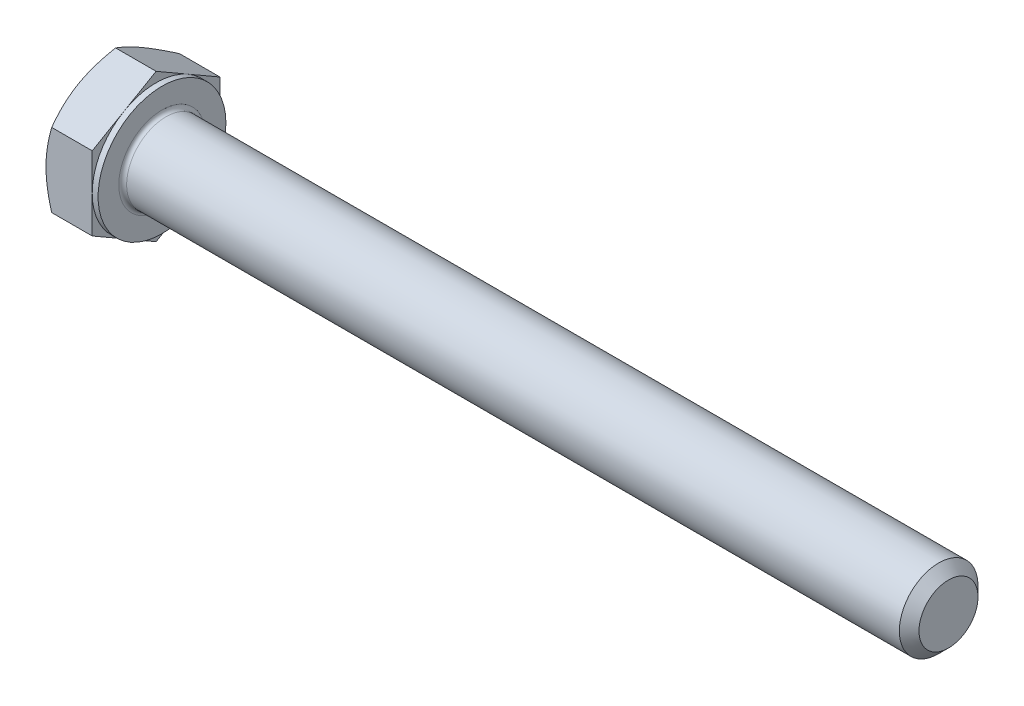
ISO-10303-21;
HEADER;
FILE_DESCRIPTION(('STEP AP214'),'2;1');
FILE_NAME('part.step','',(''),(''),'','','');
FILE_SCHEMA(('AUTOMOTIVE_DESIGN { 1 0 10303 214 1 1 1 1 }'));
ENDSEC;
DATA;
#1=APPLICATION_CONTEXT('core data for automotive mechanical design processes');
#2=APPLICATION_PROTOCOL_DEFINITION('international standard','automotive_design',2000,#1);
#3=PRODUCT_CONTEXT('',#1,'mechanical');
#4=PRODUCT('Part','Part','',(#3));
#5=PRODUCT_RELATED_PRODUCT_CATEGORY('part','',(#4));
#6=PRODUCT_DEFINITION_FORMATION('','',#4);
#7=PRODUCT_DEFINITION_CONTEXT('part definition',#1,'design');
#8=PRODUCT_DEFINITION('design','',#6,#7);
#9=PRODUCT_DEFINITION_SHAPE('','',#8);
#10=(LENGTH_UNIT() NAMED_UNIT(*) SI_UNIT(.MILLI.,.METRE.));
#11=(NAMED_UNIT(*) PLANE_ANGLE_UNIT() SI_UNIT($,.RADIAN.));
#12=(NAMED_UNIT(*) SI_UNIT($,.STERADIAN.) SOLID_ANGLE_UNIT());
#13=UNCERTAINTY_MEASURE_WITH_UNIT(LENGTH_MEASURE(1.E-05),#10,'distance_accuracy_value','');
#14=(GEOMETRIC_REPRESENTATION_CONTEXT(3) GLOBAL_UNCERTAINTY_ASSIGNED_CONTEXT((#13)) GLOBAL_UNIT_ASSIGNED_CONTEXT((#10,
#11,#12)) REPRESENTATION_CONTEXT('',''));
#15=CARTESIAN_POINT('',(0.,0.,0.));
#16=DIRECTION('',(0.,0.,1.));
#17=DIRECTION('',(1.,0.,0.));
#18=AXIS2_PLACEMENT_3D('',#15,#16,#17);
#19=CARTESIAN_POINT('',(5.3,3.75277674973256,-6.5));
#20=DIRECTION('',(0.,-0.866025403784438,0.500000000000001));
#21=DIRECTION('',(0.,-0.500000000000001,-0.866025403784438));
#22=AXIS2_PLACEMENT_3D('',#19,#20,#21);
#23=PLANE('',#22);
#24=DIRECTION('',(0.,0.500000000000001,0.866025403784438));
#25=VECTOR('',#24,1.);
#26=CARTESIAN_POINT('',(4.7,3.75277674973256,-6.5));
#27=LINE('',#26,#25);
#28=CARTESIAN_POINT('',(4.7,3.75277674973256,-6.5));
#29=VERTEX_POINT('',#28);
#30=CARTESIAN_POINT('',(4.7,5.62916512459885,-3.25));
#31=VERTEX_POINT('',#30);
#32=EDGE_CURVE('E176',#29,#31,#27,.T.);
#33=ORIENTED_EDGE('',*,*,#32,.F.);
#34=DIRECTION('',(-1.,0.,0.));
#35=VECTOR('',#34,1.);
#36=CARTESIAN_POINT('',(5.3,3.75277674973256,-6.5));
#37=LINE('',#36,#35);
#38=CARTESIAN_POINT('',(0.580556583600761,3.75277674973256,-6.5));
#39=VERTEX_POINT('',#38);
#40=EDGE_CURVE('E304',#29,#39,#37,.T.);
#41=ORIENTED_EDGE('',*,*,#40,.T.);
#42=CARTESIAN_POINT('',(0.580623251805869,7.50566896951898,0.0002));
#43=CARTESIAN_POINT('',(0.533004423075487,7.4231786300702,-0.14267745905888));
#44=CARTESIAN_POINT('',(0.487546700602708,7.34038072665458,-0.286087634534913));
#45=CARTESIAN_POINT('',(0.401548682023047,7.17411251123976,-0.574072631317195));
#46=CARTESIAN_POINT('',(0.361010507228027,7.09064192560665,-0.718647926571264));
#47=CARTESIAN_POINT('',(0.24757100112321,6.83889369625719,-1.15468865052003));
#48=CARTESIAN_POINT('',(0.183047807128741,6.66962231516081,-1.44787528284632));
#49=CARTESIAN_POINT('',(0.107386583547492,6.41631077211555,-1.88662374554437));
#50=CARTESIAN_POINT('',(0.0858328564569881,6.33302748139454,-2.03087463649469));
#51=CARTESIAN_POINT('',(0.0496903146061193,6.16608458377293,-2.32002821713809));
#52=CARTESIAN_POINT('',(0.0351008844596669,6.08242501078143,-2.46493084809889));
#53=CARTESIAN_POINT('',(0.0132587525073471,5.91496056339806,-2.75498777942832));
#54=CARTESIAN_POINT('',(0.00599772432210794,5.8311559625217,-2.90014160605421));
#55=CARTESIAN_POINT('',(-0.00103969741776869,5.66347396979287,-3.19057533697495));
#56=CARTESIAN_POINT('',(-0.000816322187795487,5.5795965802691,-3.33585523723636));
#57=CARTESIAN_POINT('',(0.010083458515165,5.34979921898453,-3.73387594242649));
#58=CARTESIAN_POINT('',(0.028381817869413,5.20395446807007,-3.98648646102757));
#59=CARTESIAN_POINT('',(0.0864063414576743,4.91323365606635,-4.49002967823568));
#60=CARTESIAN_POINT('',(0.126152338538243,4.76835861741226,-4.74096060593308));
#61=CARTESIAN_POINT('',(0.225505903202148,4.47705272008731,-5.24551722064432));
#62=CARTESIAN_POINT('',(0.285534425638025,4.33065861912702,-5.49907924143591));
#63=CARTESIAN_POINT('',(0.421774992509866,4.04005357906493,-6.00242193575904));
#64=CARTESIAN_POINT('',(0.497955034163591,3.89583891821181,-6.25220905555296));
#65=CARTESIAN_POINT('',(0.580623251805865,3.75266127967873,-6.5002));
#66=B_SPLINE_CURVE_WITH_KNOTS('',3,(#42,#43,#44,#45,#46,#47,#48,#49,#50,#51,#52,#53,#54,#55,#56,
#57,#58,#59,#60,#61,#62,#63,#64,#65),.UNSPECIFIED.,.F.,.F.,(4,2,2,2,2,2,2,2,2,2,2,4),(0.,
0.515105052395588,1.03043143507525,2.06322554824262,2.56697389547996,3.07067772176454,
3.57380860368928,4.0769239424252,4.9527935470566,5.82947446853466,6.72559912449737,
7.61996451221046),.UNSPECIFIED.);
#67=CARTESIAN_POINT('',(0.,5.62916512459885,-3.25000000000001));
#68=VERTEX_POINT('',#67);
#69=EDGE_CURVE('E231',#68,#39,#66,.T.);
#70=ORIENTED_EDGE('',*,*,#69,.F.);
#71=CARTESIAN_POINT('',(0.580556583600765,7.50555349946514,0.));
#72=VERTEX_POINT('',#71);
#73=EDGE_CURVE('E67',#72,#68,#66,.T.);
#74=ORIENTED_EDGE('',*,*,#73,.F.);
#75=DIRECTION('',(-1.,0.,0.));
#76=VECTOR('',#75,1.);
#77=CARTESIAN_POINT('',(5.3,7.50555349946514,0.));
#78=LINE('',#77,#76);
#79=CARTESIAN_POINT('',(4.7,7.50555349946514,0.));
#80=VERTEX_POINT('',#79);
#81=EDGE_CURVE('E296',#80,#72,#78,.T.);
#82=ORIENTED_EDGE('',*,*,#81,.F.);
#83=EDGE_CURVE('E174',#31,#80,#27,.T.);
#84=ORIENTED_EDGE('',*,*,#83,.F.);
#85=EDGE_LOOP('',(#33,#41,#70,#74,#82,#84));
#86=FACE_BOUND('',#85,.T.);
#87=ADVANCED_FACE('F44',(#86),#23,.F.);
#88=CARTESIAN_POINT('',(5.3,7.50555349946514,0.));
#89=DIRECTION('',(0.,-0.866025403784438,-0.500000000000001));
#90=DIRECTION('',(0.,0.500000000000001,-0.866025403784438));
#91=AXIS2_PLACEMENT_3D('',#88,#89,#90);
#92=PLANE('',#91);
#93=DIRECTION('',(0.,-0.500000000000001,0.866025403784438));
#94=VECTOR('',#93,1.);
#95=CARTESIAN_POINT('',(4.7,7.50555349946514,0.));
#96=LINE('',#95,#94);
#97=CARTESIAN_POINT('',(4.7,5.62916512459885,3.25000000000001));
#98=VERTEX_POINT('',#97);
#99=EDGE_CURVE('E173',#80,#98,#96,.T.);
#100=ORIENTED_EDGE('',*,*,#99,.F.);
#101=ORIENTED_EDGE('',*,*,#81,.T.);
#102=CARTESIAN_POINT('',(0.580623251805865,3.75266127967872,6.5002));
#103=CARTESIAN_POINT('',(0.533004423075483,3.8351516191275,6.35732254094112));
#104=CARTESIAN_POINT('',(0.487546700602704,3.91794952254312,6.21391236546509));
#105=CARTESIAN_POINT('',(0.401548682023044,4.08421773795794,5.9259273686828));
#106=CARTESIAN_POINT('',(0.361010507228023,4.16768832359105,5.78135207342873));
#107=CARTESIAN_POINT('',(0.247571001123207,4.41943655294051,5.34531134947996));
#108=CARTESIAN_POINT('',(0.183047807128738,4.58870793403689,5.05212471715368));
#109=CARTESIAN_POINT('',(0.10738658354749,4.84201947708215,4.61337625445563));
#110=CARTESIAN_POINT('',(0.0858328564569865,4.92530276780316,4.46912536350531));
#111=CARTESIAN_POINT('',(0.0496903146061183,5.09224566542477,4.17997178286191));
#112=CARTESIAN_POINT('',(0.035100884459666,5.17590523841627,4.03506915190111));
#113=CARTESIAN_POINT('',(0.0132587525073465,5.34336968579964,3.74501222057168));
#114=CARTESIAN_POINT('',(0.00599772432210779,5.427174286676,3.59985839394579));
#115=CARTESIAN_POINT('',(-0.00103969741776854,5.59485627940483,3.30942466302505));
#116=CARTESIAN_POINT('',(-0.000816322187795452,5.6787336689286,3.16414476276364));
#117=CARTESIAN_POINT('',(0.010083458515165,5.90853103021317,2.76612405757351));
#118=CARTESIAN_POINT('',(0.0283818178694132,6.05437578112763,2.51351353897243));
#119=CARTESIAN_POINT('',(0.0864063414576753,6.34509659313135,2.00997032176432));
#120=CARTESIAN_POINT('',(0.126152338538245,6.48997163178545,1.75903939406692));
#121=CARTESIAN_POINT('',(0.22550590320215,6.78127752911039,1.25448277935568));
#122=CARTESIAN_POINT('',(0.285534425638028,6.92767163007068,1.00092075856409));
#123=CARTESIAN_POINT('',(0.42177499250987,7.21827667013277,0.497578064240955));
#124=CARTESIAN_POINT('',(0.497955034163595,7.36249133098589,0.247790944447036));
#125=CARTESIAN_POINT('',(0.580623251805869,7.50566896951898,-0.000200000000000213));
#126=B_SPLINE_CURVE_WITH_KNOTS('',3,(#102,#103,#104,#105,#106,#107,#108,#109,#110,#111,#112,
#113,#114,#115,#116,#117,#118,#119,#120,#121,#122,#123,#124,#125),.UNSPECIFIED.,.F.,.F.,(4,2,2,
2,2,2,2,2,2,2,2,4),(0.,0.515105052395587,1.03043143507524,2.06322554824262,2.56697389547996,
3.07067772176454,3.57380860368928,4.0769239424252,4.9527935470566,5.82947446853466,
6.72559912449737,7.61996451221046),.UNSPECIFIED.);
#127=CARTESIAN_POINT('',(0.,5.62916512459885,3.25000000000001));
#128=VERTEX_POINT('',#127);
#129=EDGE_CURVE('E228',#128,#72,#126,.T.);
#130=ORIENTED_EDGE('',*,*,#129,.F.);
#131=CARTESIAN_POINT('',(0.58055658360076,3.75277674973256,6.5));
#132=VERTEX_POINT('',#131);
#133=EDGE_CURVE('E242',#132,#128,#126,.T.);
#134=ORIENTED_EDGE('',*,*,#133,.F.);
#135=DIRECTION('',(-1.,0.,0.));
#136=VECTOR('',#135,1.);
#137=CARTESIAN_POINT('',(5.3,3.75277674973256,6.5));
#138=LINE('',#137,#136);
#139=CARTESIAN_POINT('',(4.7,3.75277674973256,6.5));
#140=VERTEX_POINT('',#139);
#141=EDGE_CURVE('E298',#140,#132,#138,.T.);
#142=ORIENTED_EDGE('',*,*,#141,.F.);
#143=EDGE_CURVE('E141',#98,#140,#96,.T.);
#144=ORIENTED_EDGE('',*,*,#143,.F.);
#145=EDGE_LOOP('',(#100,#101,#130,#134,#142,#144));
#146=FACE_BOUND('',#145,.T.);
#147=ADVANCED_FACE('F249',(#146),#92,.F.);
#148=CARTESIAN_POINT('',(5.3,3.75277674973256,6.5));
#149=DIRECTION('',(0.,0.,-1.));
#150=DIRECTION('',(0.,1.,0.));
#151=AXIS2_PLACEMENT_3D('',#148,#149,#150);
#152=PLANE('',#151);
#153=DIRECTION('',(0.,-1.,0.));
#154=VECTOR('',#153,1.);
#155=CARTESIAN_POINT('',(4.7,3.75277674973256,6.5));
#156=LINE('',#155,#154);
#157=CARTESIAN_POINT('',(4.7,0.,6.5));
#158=VERTEX_POINT('',#157);
#159=EDGE_CURVE('E135',#140,#158,#156,.T.);
#160=ORIENTED_EDGE('',*,*,#159,.F.);
#161=ORIENTED_EDGE('',*,*,#141,.T.);
#162=CARTESIAN_POINT('',(3.18835311590246,-10.1137456678934,6.5));
#163=CARTESIAN_POINT('',(3.05034774010468,-9.82952666322138,6.5));
#164=CARTESIAN_POINT('',(2.91365616489938,-9.54465869649274,6.5));
#165=CARTESIAN_POINT('',(2.64363899497541,-8.97327978057922,6.5));
#166=CARTESIAN_POINT('',(2.51031392459097,-8.68676858388472,6.5));
#167=CARTESIAN_POINT('',(2.24710473482719,-8.11029837842689,6.5));
#168=CARTESIAN_POINT('',(2.1172430043868,-7.82032911201512,6.5));
#169=CARTESIAN_POINT('',(1.86279082826903,-7.2380954102234,6.5));
#170=CARTESIAN_POINT('',(1.73820013554674,-6.94583108317207,6.5));
#171=CARTESIAN_POINT('',(1.49176685426961,-6.34906440963036,6.5));
#172=CARTESIAN_POINT('',(1.37014257641265,-6.04447142288872,6.5));
#173=CARTESIAN_POINT('',(1.13601865758149,-5.43173420957315,6.5));
#174=CARTESIAN_POINT('',(1.02352003558022,-5.12358959079846,6.5));
#175=CARTESIAN_POINT('',(0.810575368239917,-4.5038256978226,6.5));
#176=CARTESIAN_POINT('',(0.710105232302005,-4.19221478266993,6.5));
#177=CARTESIAN_POINT('',(0.524420166144454,-3.56452019206012,6.5));
#178=CARTESIAN_POINT('',(0.439200468206418,-3.24843794792921,6.5));
#179=CARTESIAN_POINT('',(0.288524223401198,-2.61335465712783,6.5));
#180=CARTESIAN_POINT('',(0.222961865744749,-2.29437912059505,6.5));
#181=CARTESIAN_POINT('',(0.115312883130725,-1.65238219405863,6.5));
#182=CARTESIAN_POINT('',(0.0732239014690639,-1.3293612135443,6.5));
#183=CARTESIAN_POINT('',(0.0304887136381667,-0.845231171839986,6.5));
#184=CARTESIAN_POINT('',(0.0196493434273843,-0.684982209663103,6.5));
#185=CARTESIAN_POINT('',(0.00475298486143982,-0.36416234906546,6.5));
#186=CARTESIAN_POINT('',(0.000695882908832042,-0.203591456081879,6.5));
#187=CARTESIAN_POINT('',(-0.000531597190094996,0.117577430374297,6.5));
#188=CARTESIAN_POINT('',(0.00229809017012694,0.278175424090143,6.5));
#189=CARTESIAN_POINT('',(0.0147726845547639,0.599108972823505,6.5));
#190=CARTESIAN_POINT('',(0.0244179260500518,0.759444514574217,6.5));
#191=CARTESIAN_POINT('',(0.0554961939343001,1.14369946602534,6.5));
#192=CARTESIAN_POINT('',(0.0801030490514518,1.36736763045086,6.5));
#193=CARTESIAN_POINT('',(0.141246537453378,1.81305591311688,6.5));
#194=CARTESIAN_POINT('',(0.177784759614452,2.03507580783108,6.5));
#195=CARTESIAN_POINT('',(0.303360001332115,2.69839633433796,6.5));
#196=CARTESIAN_POINT('',(0.408335815147595,3.13672010374357,6.5));
#197=CARTESIAN_POINT('',(0.59056459313494,3.79232112918118,6.5));
#198=CARTESIAN_POINT('',(0.656313198979091,4.01299150874073,6.5));
#199=CARTESIAN_POINT('',(0.794681634200732,4.45218859008391,6.5));
#200=CARTESIAN_POINT('',(0.867301513122617,4.67071527639819,6.5));
#201=CARTESIAN_POINT('',(1.01824353854295,5.10569490252726,6.5));
#202=CARTESIAN_POINT('',(1.09656388232839,5.32214847365075,6.5));
#203=CARTESIAN_POINT('',(1.25798086164821,5.75325725773039,6.5));
#204=CARTESIAN_POINT('',(1.34107741035995,5.96791250329556,6.5));
#205=CARTESIAN_POINT('',(1.56029019583041,6.51888445936372,6.5));
#206=CARTESIAN_POINT('',(1.69936356666534,6.85402316813627,6.5));
#207=CARTESIAN_POINT('',(1.98501958087353,7.52109583939393,6.5));
#208=CARTESIAN_POINT('',(2.13160288780791,7.85302951559933,6.5));
#209=CARTESIAN_POINT('',(2.43059748044951,8.51437865518657,6.5));
#210=CARTESIAN_POINT('',(2.58301057596959,8.84379329784093,6.5));
#211=CARTESIAN_POINT('',(2.89234869374926,9.50047798683784,6.5));
#212=CARTESIAN_POINT('',(3.04927357220058,9.82774810112757,6.5));
#213=CARTESIAN_POINT('',(3.36692013130636,10.4809971975748,6.5));
#214=CARTESIAN_POINT('',(3.52764676491733,10.8069737667408,6.5));
#215=CARTESIAN_POINT('',(3.85198555554899,11.4574882901034,6.5));
#216=CARTESIAN_POINT('',(4.01559773123065,11.7820262349792,6.5));
#217=CARTESIAN_POINT('',(4.50986185003773,12.7537468114441,6.5));
#218=CARTESIAN_POINT('',(4.84399997978541,13.3991555932469,6.5));
#219=CARTESIAN_POINT('',(5.48575990265919,14.6239779290894,6.5));
#220=CARTESIAN_POINT('',(5.79279643372278,15.2036995760604,6.5));
#221=CARTESIAN_POINT('',(6.4106918822763,16.3611382637875,6.5));
#222=CARTESIAN_POINT('',(6.72155099010109,16.938855202873,6.5));
#223=CARTESIAN_POINT('',(7.34519775439014,18.0910273555999,6.5));
#224=CARTESIAN_POINT('',(7.65797694168864,18.665487160613,6.5));
#225=CARTESIAN_POINT('',(8.28574397153078,19.8131486204439,6.5));
#226=CARTESIAN_POINT('',(8.60073166294279,20.3863503578957,6.5));
#227=CARTESIAN_POINT('',(8.91652967168741,20.9591024521449,6.5));
#228=B_SPLINE_CURVE_WITH_KNOTS('',3,(#162,#163,#164,#165,#166,#167,#168,#169,#170,#171,#172,
#173,#174,#175,#176,#177,#178,#179,#180,#181,#182,#183,#184,#185,#186,#187,#188,#189,#190,#191,
#192,#193,#194,#195,#196,#197,#198,#199,#200,#201,#202,#203,#204,#205,#206,#207,#208,#209,#210,
#211,#212,#213,#214,#215,#216,#217,#218,#219,#220,#221,#222,#223,#224,#225,#226,#227),
.UNSPECIFIED.,.F.,.F.,(4,2,2,2,2,2,2,2,2,2,2,2,2,2,2,2,2,2,2,2,2,2,2,2,2,2,2,2,2,2,2,2,4),(0.,
0.947868666702312,1.89588406483492,2.84900320930536,3.80207763304315,4.78589774082711,
5.76982755141752,6.75175256246685,7.73337005764394,8.70960474890991,9.68574140951124,
10.1674651053568,10.6491807326436,11.1309009419855,11.6126447932157,12.287317572382,
12.9620802330383,14.312318438093,15.0030310344276,15.6937486114326,16.3842486973571,
17.0747362352244,18.1631508683747,19.2516618378194,20.3405135142583,21.4293305231019,
22.5196540547637,23.6099846401957,25.7902468235016,27.7582608872418,29.7263733429304,
31.6886408595598,33.6507753806319),.UNSPECIFIED.);
#229=CARTESIAN_POINT('',(0.,0.,6.5));
#230=VERTEX_POINT('',#229);
#231=EDGE_CURVE('E243',#230,#132,#228,.T.);
#232=ORIENTED_EDGE('',*,*,#231,.F.);
#233=CARTESIAN_POINT('',(0.580556583600765,-3.75277674973258,6.5));
#234=VERTEX_POINT('',#233);
#235=EDGE_CURVE('E305',#234,#230,#228,.T.);
#236=ORIENTED_EDGE('',*,*,#235,.F.);
#237=DIRECTION('',(-1.,0.,0.));
#238=VECTOR('',#237,1.);
#239=CARTESIAN_POINT('',(5.3,-3.75277674973258,6.5));
#240=LINE('',#239,#238);
#241=CARTESIAN_POINT('',(4.7,-3.75277674973258,6.5));
#242=VERTEX_POINT('',#241);
#243=EDGE_CURVE('E167',#242,#234,#240,.T.);
#244=ORIENTED_EDGE('',*,*,#243,.F.);
#245=EDGE_CURVE('E145',#158,#242,#156,.T.);
#246=ORIENTED_EDGE('',*,*,#245,.F.);
#247=EDGE_LOOP('',(#160,#161,#232,#236,#244,#246));
#248=FACE_BOUND('',#247,.T.);
#249=ADVANCED_FACE('F165',(#248),#152,.F.);
#250=CARTESIAN_POINT('',(5.3,-7.50555349946515,0.));
#251=DIRECTION('',(0.,0.866025403784438,-0.500000000000001));
#252=DIRECTION('',(0.,0.500000000000001,0.866025403784438));
#253=AXIS2_PLACEMENT_3D('',#250,#251,#252);
#254=PLANE('',#253);
#255=DIRECTION('',(0.,-0.500000000000001,-0.866025403784438));
#256=VECTOR('',#255,1.);
#257=CARTESIAN_POINT('',(4.7,-7.50555349946515,0.));
#258=LINE('',#257,#256);
#259=CARTESIAN_POINT('',(4.7,-5.62916512459885,3.25));
#260=VERTEX_POINT('',#259);
#261=EDGE_CURVE('E152',#242,#260,#258,.T.);
#262=ORIENTED_EDGE('',*,*,#261,.F.);
#263=ORIENTED_EDGE('',*,*,#243,.T.);
#264=CARTESIAN_POINT('',(0.580623251805877,-7.50566896951899,-0.000199999999999834));
#265=CARTESIAN_POINT('',(0.533004423075495,-7.42317863007021,0.14267745905888));
#266=CARTESIAN_POINT('',(0.487546700602716,-7.3403807266546,0.286087634534913));
#267=CARTESIAN_POINT('',(0.401548682023055,-7.17411251123977,0.574072631317195));
#268=CARTESIAN_POINT('',(0.361010507228034,-7.09064192560666,0.718647926571265));
#269=CARTESIAN_POINT('',(0.247571001123217,-6.8388936962572,1.15468865052004));
#270=CARTESIAN_POINT('',(0.183047807128748,-6.66962231516082,1.44787528284632));
#271=CARTESIAN_POINT('',(0.107386583547499,-6.41631077211556,1.88662374554438));
#272=CARTESIAN_POINT('',(0.0858328564569948,-6.33302748139455,2.03087463649469));
#273=CARTESIAN_POINT('',(0.049690314606126,-6.16608458377294,2.32002821713809));
#274=CARTESIAN_POINT('',(0.0351008844596736,-6.08242501078144,2.46493084809889));
#275=CARTESIAN_POINT('',(0.0132587525073536,-5.91496056339808,2.75498777942833));
#276=CARTESIAN_POINT('',(0.00599772432211453,-5.83115596252171,2.90014160605422));
#277=CARTESIAN_POINT('',(-0.001039697417762,-5.66347396979288,3.19057533697495));
#278=CARTESIAN_POINT('',(-0.000816322187788739,-5.57959658026911,3.33585523723636));
#279=CARTESIAN_POINT('',(0.0100834585151718,-5.34979921898454,3.7338759424265));
#280=CARTESIAN_POINT('',(0.0283818178694196,-5.20395446807008,3.98648646102758));
#281=CARTESIAN_POINT('',(0.0864063414576807,-4.91323365606637,4.49002967823568));
#282=CARTESIAN_POINT('',(0.12615233853825,-4.76835861741227,4.74096060593309));
#283=CARTESIAN_POINT('',(0.225505903202154,-4.47705272008733,5.24551722064432));
#284=CARTESIAN_POINT('',(0.28553442563803,-4.33065861912704,5.49907924143592));
#285=CARTESIAN_POINT('',(0.421774992509871,-4.04005357906495,6.00242193575905));
#286=CARTESIAN_POINT('',(0.497955034163595,-3.89583891821182,6.25220905555296));
#287=CARTESIAN_POINT('',(0.580623251805869,-3.75266127967874,6.5002));
#288=B_SPLINE_CURVE_WITH_KNOTS('',3,(#264,#265,#266,#267,#268,#269,#270,#271,#272,#273,#274,
#275,#276,#277,#278,#279,#280,#281,#282,#283,#284,#285,#286,#287),.UNSPECIFIED.,.F.,.F.,(4,2,2,
2,2,2,2,2,2,2,2,4),(0.,0.515105052395588,1.03043143507525,2.06322554824263,2.56697389547997,
3.07067772176454,3.57380860368929,4.07692394242521,4.95279354705661,5.82947446853467,
6.72559912449737,7.61996451221046),.UNSPECIFIED.);
#289=CARTESIAN_POINT('',(0.,-5.62916512459885,3.25000000000001));
#290=VERTEX_POINT('',#289);
#291=EDGE_CURVE('E230',#290,#234,#288,.T.);
#292=ORIENTED_EDGE('',*,*,#291,.F.);
#293=CARTESIAN_POINT('',(0.580556583600772,-7.50555349946515,0.));
#294=VERTEX_POINT('',#293);
#295=EDGE_CURVE('E222',#294,#290,#288,.T.);
#296=ORIENTED_EDGE('',*,*,#295,.F.);
#297=DIRECTION('',(-1.,0.,0.));
#298=VECTOR('',#297,1.);
#299=CARTESIAN_POINT('',(5.3,-7.50555349946515,0.));
#300=LINE('',#299,#298);
#301=CARTESIAN_POINT('',(4.7,-7.50555349946515,0.));
#302=VERTEX_POINT('',#301);
#303=EDGE_CURVE('E301',#302,#294,#300,.T.);
#304=ORIENTED_EDGE('',*,*,#303,.F.);
#305=EDGE_CURVE('E168',#260,#302,#258,.T.);
#306=ORIENTED_EDGE('',*,*,#305,.F.);
#307=EDGE_LOOP('',(#262,#263,#292,#296,#304,#306));
#308=FACE_BOUND('',#307,.T.);
#309=ADVANCED_FACE('F213',(#308),#254,.F.);
#310=CARTESIAN_POINT('',(5.3,-3.75277674973258,-6.5));
#311=DIRECTION('',(0.,0.866025403784438,0.500000000000001));
#312=DIRECTION('',(0.,-0.500000000000001,0.866025403784438));
#313=AXIS2_PLACEMENT_3D('',#310,#311,#312);
#314=PLANE('',#313);
#315=DIRECTION('',(0.,0.500000000000001,-0.866025403784438));
#316=VECTOR('',#315,1.);
#317=CARTESIAN_POINT('',(4.7,-3.75277674973258,-6.5));
#318=LINE('',#317,#316);
#319=CARTESIAN_POINT('',(4.7,-5.62916512459885,-3.25));
#320=VERTEX_POINT('',#319);
#321=EDGE_CURVE('E351',#302,#320,#318,.T.);
#322=ORIENTED_EDGE('',*,*,#321,.F.);
#323=ORIENTED_EDGE('',*,*,#303,.T.);
#324=CARTESIAN_POINT('',(0.580623251805869,-3.75266127967874,-6.5002));
#325=CARTESIAN_POINT('',(0.533004423075488,-3.83515161912751,-6.35732254094112));
#326=CARTESIAN_POINT('',(0.487546700602708,-3.91794952254313,-6.21391236546509));
#327=CARTESIAN_POINT('',(0.401548682023049,-4.08421773795795,-5.92592736868281));
#328=CARTESIAN_POINT('',(0.361010507228029,-4.16768832359106,-5.78135207342874));
#329=CARTESIAN_POINT('',(0.247571001123213,-4.41943655294052,-5.34531134947997));
#330=CARTESIAN_POINT('',(0.183047807128744,-4.58870793403691,-5.05212471715368));
#331=CARTESIAN_POINT('',(0.107386583547496,-4.84201947708216,-4.61337625445563));
#332=CARTESIAN_POINT('',(0.085832856456992,-4.92530276780317,-4.46912536350531));
#333=CARTESIAN_POINT('',(0.0496903146061239,-5.09224566542478,-4.17997178286191));
#334=CARTESIAN_POINT('',(0.035100884459672,-5.17590523841629,-4.03506915190111));
#335=CARTESIAN_POINT('',(0.0132587525073528,-5.34336968579965,-3.74501222057168));
#336=CARTESIAN_POINT('',(0.00599772432211393,-5.42717428667601,-3.59985839394579));
#337=CARTESIAN_POINT('',(-0.00103969741776215,-5.59485627940485,-3.30942466302505));
#338=CARTESIAN_POINT('',(-0.000816322187788696,-5.67873366892861,-3.16414476276364));
#339=CARTESIAN_POINT('',(0.0100834585151724,-5.90853103021318,-2.76612405757351));
#340=CARTESIAN_POINT('',(0.0283818178694207,-6.05437578112765,-2.51351353897243));
#341=CARTESIAN_POINT('',(0.086406341457683,-6.34509659313136,-2.00997032176432));
#342=CARTESIAN_POINT('',(0.126152338538253,-6.48997163178546,-1.75903939406692));
#343=CARTESIAN_POINT('',(0.225505903202158,-6.7812775291104,-1.25448277935568));
#344=CARTESIAN_POINT('',(0.285534425638035,-6.92767163007069,-1.00092075856409));
#345=CARTESIAN_POINT('',(0.421774992509877,-7.21827667013278,-0.497578064240955));
#346=CARTESIAN_POINT('',(0.497955034163602,-7.3624913309859,-0.247790944447036));
#347=CARTESIAN_POINT('',(0.580623251805876,-7.50566896951899,0.000199999999999993));
#348=B_SPLINE_CURVE_WITH_KNOTS('',3,(#324,#325,#326,#327,#328,#329,#330,#331,#332,#333,#334,
#335,#336,#337,#338,#339,#340,#341,#342,#343,#344,#345,#346,#347),.UNSPECIFIED.,.F.,.F.,(4,2,2,
2,2,2,2,2,2,2,2,4),(0.,0.515105052395587,1.03043143507524,2.06322554824262,2.56697389547996,
3.07067772176454,3.57380860368928,4.0769239424252,4.9527935470566,5.82947446853466,
6.72559912449736,7.61996451221046),.UNSPECIFIED.);
#349=CARTESIAN_POINT('',(0.,-5.62916512459885,-3.25));
#350=VERTEX_POINT('',#349);
#351=EDGE_CURVE('E229',#350,#294,#348,.T.);
#352=ORIENTED_EDGE('',*,*,#351,.F.);
#353=CARTESIAN_POINT('',(0.580556583600765,-3.75277674973258,-6.5));
#354=VERTEX_POINT('',#353);
#355=EDGE_CURVE('E190',#354,#350,#348,.T.);
#356=ORIENTED_EDGE('',*,*,#355,.F.);
#357=DIRECTION('',(-1.,0.,0.));
#358=VECTOR('',#357,1.);
#359=CARTESIAN_POINT('',(5.3,-3.75277674973258,-6.5));
#360=LINE('',#359,#358);
#361=CARTESIAN_POINT('',(4.7,-3.75277674973258,-6.5));
#362=VERTEX_POINT('',#361);
#363=EDGE_CURVE('E303',#362,#354,#360,.T.);
#364=ORIENTED_EDGE('',*,*,#363,.F.);
#365=EDGE_CURVE('E163',#320,#362,#318,.T.);
#366=ORIENTED_EDGE('',*,*,#365,.F.);
#367=EDGE_LOOP('',(#322,#323,#352,#356,#364,#366));
#368=FACE_BOUND('',#367,.T.);
#369=ADVANCED_FACE('F206',(#368),#314,.F.);
#370=CARTESIAN_POINT('',(5.3,3.75277674973256,-6.5));
#371=DIRECTION('',(0.,0.,1.));
#372=DIRECTION('',(0.,-1.,0.));
#373=AXIS2_PLACEMENT_3D('',#370,#371,#372);
#374=PLANE('',#373);
#375=DIRECTION('',(0.,1.,0.));
#376=VECTOR('',#375,1.);
#377=CARTESIAN_POINT('',(4.7,3.75277674973256,-6.5));
#378=LINE('',#377,#376);
#379=CARTESIAN_POINT('',(4.7,0.,-6.5));
#380=VERTEX_POINT('',#379);
#381=EDGE_CURVE('E275',#362,#380,#378,.T.);
#382=ORIENTED_EDGE('',*,*,#381,.F.);
#383=ORIENTED_EDGE('',*,*,#363,.T.);
#384=CARTESIAN_POINT('',(3.18835311590246,-10.1137456678934,-6.5));
#385=CARTESIAN_POINT('',(3.05034774010468,-9.82952666322138,-6.5));
#386=CARTESIAN_POINT('',(2.91365616489938,-9.54465869649274,-6.5));
#387=CARTESIAN_POINT('',(2.64363899497542,-8.97327978057922,-6.5));
#388=CARTESIAN_POINT('',(2.51031392459097,-8.68676858388472,-6.5));
#389=CARTESIAN_POINT('',(2.24710473482719,-8.11029837842689,-6.5));
#390=CARTESIAN_POINT('',(2.1172430043868,-7.82032911201512,-6.5));
#391=CARTESIAN_POINT('',(1.86279082826903,-7.2380954102234,-6.5));
#392=CARTESIAN_POINT('',(1.73820013554675,-6.94583108317207,-6.5));
#393=CARTESIAN_POINT('',(1.49176685426962,-6.34906440963036,-6.5));
#394=CARTESIAN_POINT('',(1.37014257641266,-6.04447142288872,-6.5));
#395=CARTESIAN_POINT('',(1.13601865758149,-5.43173420957316,-6.5));
#396=CARTESIAN_POINT('',(1.02352003558022,-5.12358959079846,-6.5));
#397=CARTESIAN_POINT('',(0.810575368239919,-4.5038256978226,-6.5));
#398=CARTESIAN_POINT('',(0.710105232302007,-4.19221478266993,-6.5));
#399=CARTESIAN_POINT('',(0.524420166144455,-3.56452019206012,-6.5));
#400=CARTESIAN_POINT('',(0.439200468206419,-3.24843794792921,-6.5));
#401=CARTESIAN_POINT('',(0.288524223401198,-2.61335465712783,-6.5));
#402=CARTESIAN_POINT('',(0.222961865744749,-2.29437912059505,-6.5));
#403=CARTESIAN_POINT('',(0.115312883130726,-1.65238219405862,-6.5));
#404=CARTESIAN_POINT('',(0.0732239014690635,-1.3293612135443,-6.5));
#405=CARTESIAN_POINT('',(0.0304887136381666,-0.845231171839984,-6.5));
#406=CARTESIAN_POINT('',(0.0196493434273846,-0.684982209663101,-6.5));
#407=CARTESIAN_POINT('',(0.0047529848614402,-0.364162349065459,-6.5));
#408=CARTESIAN_POINT('',(0.000695882908832254,-0.203591456081878,-6.5));
#409=CARTESIAN_POINT('',(-0.000531597190094705,0.117577430374298,-6.5));
#410=CARTESIAN_POINT('',(0.00229809017012751,0.278175424090144,-6.5));
#411=CARTESIAN_POINT('',(0.0147726845547647,0.599108972823507,-6.5));
#412=CARTESIAN_POINT('',(0.0244179260500526,0.759444514574219,-6.5));
#413=CARTESIAN_POINT('',(0.0554961939343006,1.14369946602534,-6.5));
#414=CARTESIAN_POINT('',(0.0801030490514521,1.36736763045086,-6.5));
#415=CARTESIAN_POINT('',(0.141246537453378,1.81305591311688,-6.5));
#416=CARTESIAN_POINT('',(0.177784759614452,2.03507580783108,-6.5));
#417=CARTESIAN_POINT('',(0.303360001332115,2.69839633433795,-6.5));
#418=CARTESIAN_POINT('',(0.408335815147594,3.13672010374357,-6.5));
#419=CARTESIAN_POINT('',(0.59056459313494,3.79232112918118,-6.5));
#420=CARTESIAN_POINT('',(0.656313198979091,4.01299150874073,-6.5));
#421=CARTESIAN_POINT('',(0.794681634200732,4.45218859008391,-6.5));
#422=CARTESIAN_POINT('',(0.867301513122617,4.67071527639819,-6.5));
#423=CARTESIAN_POINT('',(1.01824353854295,5.10569490252726,-6.5));
#424=CARTESIAN_POINT('',(1.09656388232839,5.32214847365075,-6.5));
#425=CARTESIAN_POINT('',(1.25798086164821,5.75325725773039,-6.5));
#426=CARTESIAN_POINT('',(1.34107741035995,5.96791250329556,-6.5));
#427=CARTESIAN_POINT('',(1.56029019583041,6.51888445936372,-6.5));
#428=CARTESIAN_POINT('',(1.69936356666534,6.85402316813626,-6.5));
#429=CARTESIAN_POINT('',(1.98501958087353,7.52109583939393,-6.5));
#430=CARTESIAN_POINT('',(2.13160288780791,7.85302951559933,-6.5));
#431=CARTESIAN_POINT('',(2.43059748044951,8.51437865518657,-6.5));
#432=CARTESIAN_POINT('',(2.58301057596959,8.84379329784094,-6.5));
#433=CARTESIAN_POINT('',(2.89234869374926,9.50047798683784,-6.5));
#434=CARTESIAN_POINT('',(3.04927357220059,9.82774810112757,-6.5));
#435=CARTESIAN_POINT('',(3.36692013130636,10.4809971975748,-6.5));
#436=CARTESIAN_POINT('',(3.52764676491733,10.8069737667408,-6.5));
#437=CARTESIAN_POINT('',(3.85198555554899,11.4574882901034,-6.5));
#438=CARTESIAN_POINT('',(4.01559773123066,11.7820262349792,-6.5));
#439=CARTESIAN_POINT('',(4.50986185003773,12.7537468114441,-6.5));
#440=CARTESIAN_POINT('',(4.84399997978541,13.3991555932469,-6.5));
#441=CARTESIAN_POINT('',(5.48575990265919,14.6239779290894,-6.5));
#442=CARTESIAN_POINT('',(5.79279643372279,15.2036995760604,-6.5));
#443=CARTESIAN_POINT('',(6.4106918822763,16.3611382637875,-6.5));
#444=CARTESIAN_POINT('',(6.72155099010109,16.938855202873,-6.5));
#445=CARTESIAN_POINT('',(7.34519775439015,18.0910273555999,-6.5));
#446=CARTESIAN_POINT('',(7.65797694168864,18.665487160613,-6.5));
#447=CARTESIAN_POINT('',(8.28574397153078,19.8131486204439,-6.5));
#448=CARTESIAN_POINT('',(8.60073166294279,20.3863503578957,-6.5));
#449=CARTESIAN_POINT('',(8.91652967168742,20.9591024521449,-6.49999999999999));
#450=B_SPLINE_CURVE_WITH_KNOTS('',3,(#384,#385,#386,#387,#388,#389,#390,#391,#392,#393,#394,
#395,#396,#397,#398,#399,#400,#401,#402,#403,#404,#405,#406,#407,#408,#409,#410,#411,#412,#413,
#414,#415,#416,#417,#418,#419,#420,#421,#422,#423,#424,#425,#426,#427,#428,#429,#430,#431,#432,
#433,#434,#435,#436,#437,#438,#439,#440,#441,#442,#443,#444,#445,#446,#447,#448,#449),
.UNSPECIFIED.,.F.,.F.,(4,2,2,2,2,2,2,2,2,2,2,2,2,2,2,2,2,2,2,2,2,2,2,2,2,2,2,2,2,2,2,2,4),(0.,
0.947868666702312,1.89588406483492,2.84900320930536,3.80207763304314,4.7858977408271,
5.76982755141752,6.75175256246685,7.73337005764394,8.70960474890992,9.68574140951124,
10.1674651053568,10.6491807326436,11.1309009419855,11.6126447932157,12.287317572382,
12.9620802330384,14.312318438093,15.0030310344276,15.6937486114326,16.3842486973571,
17.0747362352244,18.1631508683747,19.2516618378194,20.3405135142583,21.4293305231019,
22.5196540547637,23.6099846401957,25.7902468235017,27.7582608872418,29.7263733429304,
31.6886408595598,33.6507753806319),.UNSPECIFIED.);
#451=CARTESIAN_POINT('',(0.,0.,-6.5));
#452=VERTEX_POINT('',#451);
#453=EDGE_CURVE('E180',#452,#354,#450,.F.);
#454=ORIENTED_EDGE('',*,*,#453,.F.);
#455=EDGE_CURVE('E189',#39,#452,#450,.F.);
#456=ORIENTED_EDGE('',*,*,#455,.F.);
#457=ORIENTED_EDGE('',*,*,#40,.F.);
#458=EDGE_CURVE('E279',#380,#29,#378,.T.);
#459=ORIENTED_EDGE('',*,*,#458,.F.);
#460=EDGE_LOOP('',(#382,#383,#454,#456,#457,#459));
#461=FACE_BOUND('',#460,.T.);
#462=ADVANCED_FACE('F201',(#461),#374,.F.);
#463=CARTESIAN_POINT('',(0.,0.,0.));
#464=DIRECTION('',(1.,0.,0.));
#465=DIRECTION('',(0.,0.,-1.));
#466=AXIS2_PLACEMENT_3D('',#463,#464,#465);
#467=CONICAL_SURFACE('',#466,6.5,1.0471975511966);
#468=ORIENTED_EDGE('',*,*,#355,.T.);
#469=CARTESIAN_POINT('',(0.,0.,0.));
#470=DIRECTION('',(1.,0.,0.));
#471=DIRECTION('',(0.,0.,-1.));
#472=AXIS2_PLACEMENT_3D('',#469,#470,#471);
#473=CIRCLE('',#472,6.5);
#474=EDGE_CURVE('E292',#350,#452,#473,.T.);
#475=ORIENTED_EDGE('',*,*,#474,.T.);
#476=ORIENTED_EDGE('',*,*,#453,.T.);
#477=EDGE_LOOP('',(#468,#475,#476));
#478=FACE_BOUND('',#477,.T.);
#479=ADVANCED_FACE('F205',(#478),#467,.T.);
#480=ORIENTED_EDGE('',*,*,#295,.T.);
#481=EDGE_CURVE('E295',#290,#350,#473,.T.);
#482=ORIENTED_EDGE('',*,*,#481,.T.);
#483=ORIENTED_EDGE('',*,*,#351,.T.);
#484=EDGE_LOOP('',(#480,#482,#483));
#485=FACE_BOUND('',#484,.T.);
#486=ADVANCED_FACE('F348',(#485),#467,.T.);
#487=ORIENTED_EDGE('',*,*,#235,.T.);
#488=EDGE_CURVE('E325',#230,#290,#473,.T.);
#489=ORIENTED_EDGE('',*,*,#488,.T.);
#490=ORIENTED_EDGE('',*,*,#291,.T.);
#491=EDGE_LOOP('',(#487,#489,#490));
#492=FACE_BOUND('',#491,.T.);
#493=ADVANCED_FACE('F197',(#492),#467,.T.);
#494=ORIENTED_EDGE('',*,*,#231,.T.);
#495=ORIENTED_EDGE('',*,*,#133,.T.);
#496=CARTESIAN_POINT('',(0.,0.,0.));
#497=DIRECTION('',(-1.,0.,0.));
#498=DIRECTION('',(0.,0.,1.));
#499=AXIS2_PLACEMENT_3D('',#496,#497,#498);
#500=CIRCLE('',#499,6.5);
#501=EDGE_CURVE('E177',#230,#128,#500,.T.);
#502=ORIENTED_EDGE('',*,*,#501,.F.);
#503=EDGE_LOOP('',(#494,#495,#502));
#504=FACE_BOUND('',#503,.T.);
#505=ADVANCED_FACE('F319',(#504),#467,.T.);
#506=ORIENTED_EDGE('',*,*,#129,.T.);
#507=ORIENTED_EDGE('',*,*,#73,.T.);
#508=EDGE_CURVE('E290',#68,#128,#473,.T.);
#509=ORIENTED_EDGE('',*,*,#508,.T.);
#510=EDGE_LOOP('',(#506,#507,#509));
#511=FACE_BOUND('',#510,.T.);
#512=ADVANCED_FACE('F323',(#511),#467,.T.);
#513=ORIENTED_EDGE('',*,*,#69,.T.);
#514=ORIENTED_EDGE('',*,*,#455,.T.);
#515=EDGE_CURVE('E289',#452,#68,#473,.T.);
#516=ORIENTED_EDGE('',*,*,#515,.T.);
#517=EDGE_LOOP('',(#513,#514,#516));
#518=FACE_BOUND('',#517,.T.);
#519=ADVANCED_FACE('F339',(#518),#467,.T.);
#520=CARTESIAN_POINT('',(0.,7.50555349946514,0.));
#521=DIRECTION('',(1.,0.,0.));
#522=DIRECTION('',(0.,0.,-1.));
#523=AXIS2_PLACEMENT_3D('',#520,#521,#522);
#524=PLANE('',#523);
#525=ORIENTED_EDGE('',*,*,#515,.F.);
#526=ORIENTED_EDGE('',*,*,#474,.F.);
#527=ORIENTED_EDGE('',*,*,#481,.F.);
#528=ORIENTED_EDGE('',*,*,#488,.F.);
#529=ORIENTED_EDGE('',*,*,#501,.T.);
#530=ORIENTED_EDGE('',*,*,#508,.F.);
#531=EDGE_LOOP('',(#525,#526,#527,#528,#529,#530));
#532=FACE_BOUND('',#531,.T.);
#533=ADVANCED_FACE('F208',(#532),#524,.F.);
#534=CARTESIAN_POINT('',(4.7,6.5,0.));
#535=DIRECTION('',(1.,0.,0.));
#536=DIRECTION('',(0.,0.,-1.));
#537=AXIS2_PLACEMENT_3D('',#534,#535,#536);
#538=PLANE('',#537);
#539=ORIENTED_EDGE('',*,*,#32,.T.);
#540=CARTESIAN_POINT('',(4.7,0.,0.));
#541=DIRECTION('',(-1.,0.,0.));
#542=DIRECTION('',(0.,0.,1.));
#543=AXIS2_PLACEMENT_3D('',#540,#541,#542);
#544=CIRCLE('',#543,6.5);
#545=EDGE_CURVE('E59',#31,#380,#544,.T.);
#546=ORIENTED_EDGE('',*,*,#545,.T.);
#547=ORIENTED_EDGE('',*,*,#458,.T.);
#548=EDGE_LOOP('',(#539,#546,#547));
#549=FACE_BOUND('',#548,.T.);
#550=ADVANCED_FACE('F357',(#549),#538,.T.);
#551=ORIENTED_EDGE('',*,*,#83,.T.);
#552=ORIENTED_EDGE('',*,*,#99,.T.);
#553=EDGE_CURVE('E162',#98,#31,#544,.T.);
#554=ORIENTED_EDGE('',*,*,#553,.T.);
#555=EDGE_LOOP('',(#551,#552,#554));
#556=FACE_BOUND('',#555,.T.);
#557=ADVANCED_FACE('F359',(#556),#538,.T.);
#558=ORIENTED_EDGE('',*,*,#143,.T.);
#559=ORIENTED_EDGE('',*,*,#159,.T.);
#560=EDGE_CURVE('E139',#158,#98,#544,.T.);
#561=ORIENTED_EDGE('',*,*,#560,.T.);
#562=EDGE_LOOP('',(#558,#559,#561));
#563=FACE_BOUND('',#562,.T.);
#564=ADVANCED_FACE('F137',(#563),#538,.T.);
#565=ORIENTED_EDGE('',*,*,#245,.T.);
#566=ORIENTED_EDGE('',*,*,#261,.T.);
#567=EDGE_CURVE('E149',#260,#158,#544,.T.);
#568=ORIENTED_EDGE('',*,*,#567,.T.);
#569=EDGE_LOOP('',(#565,#566,#568));
#570=FACE_BOUND('',#569,.T.);
#571=ADVANCED_FACE('F150',(#570),#538,.T.);
#572=ORIENTED_EDGE('',*,*,#305,.T.);
#573=ORIENTED_EDGE('',*,*,#321,.T.);
#574=EDGE_CURVE('E156',#320,#260,#544,.T.);
#575=ORIENTED_EDGE('',*,*,#574,.T.);
#576=EDGE_LOOP('',(#572,#573,#575));
#577=FACE_BOUND('',#576,.T.);
#578=ADVANCED_FACE('F373',(#577),#538,.T.);
#579=ORIENTED_EDGE('',*,*,#365,.T.);
#580=ORIENTED_EDGE('',*,*,#381,.T.);
#581=EDGE_CURVE('E356',#380,#320,#544,.T.);
#582=ORIENTED_EDGE('',*,*,#581,.T.);
#583=EDGE_LOOP('',(#579,#580,#582));
#584=FACE_BOUND('',#583,.T.);
#585=ADVANCED_FACE('F354',(#584),#538,.T.);
#586=CARTESIAN_POINT('',(0.,0.,0.));
#587=DIRECTION('',(-1.,0.,0.));
#588=DIRECTION('',(0.,0.,1.));
#589=AXIS2_PLACEMENT_3D('',#586,#587,#588);
#590=CYLINDRICAL_SURFACE('',#589,6.5);
#591=ORIENTED_EDGE('',*,*,#545,.F.);
#592=ORIENTED_EDGE('',*,*,#553,.F.);
#593=ORIENTED_EDGE('',*,*,#560,.F.);
#594=ORIENTED_EDGE('',*,*,#567,.F.);
#595=ORIENTED_EDGE('',*,*,#574,.F.);
#596=ORIENTED_EDGE('',*,*,#581,.F.);
#597=EDGE_LOOP('',(#591,#592,#593,#594,#595,#596));
#598=FACE_BOUND('',#597,.T.);
#599=CARTESIAN_POINT('',(5.3,0.,0.));
#600=DIRECTION('',(1.,0.,0.));
#601=DIRECTION('',(0.,0.,-1.));
#602=AXIS2_PLACEMENT_3D('',#599,#600,#601);
#603=CIRCLE('',#602,6.5);
#604=CARTESIAN_POINT('',(5.3,0.,-6.5));
#605=VERTEX_POINT('',#604);
#606=EDGE_CURVE('E288',#605,#605,#603,.T.);
#607=ORIENTED_EDGE('',*,*,#606,.F.);
#608=EDGE_LOOP('',(#607));
#609=FACE_BOUND('',#608,.T.);
#610=ADVANCED_FACE('F159',(#598,#609),#590,.T.);
#611=CARTESIAN_POINT('',(85.3,0.,0.));
#612=DIRECTION('',(-1.,0.,0.));
#613=DIRECTION('',(0.,0.,1.));
#614=AXIS2_PLACEMENT_3D('',#611,#612,#613);
#615=PLANE('',#614);
#616=CARTESIAN_POINT('',(85.3,0.,0.));
#617=DIRECTION('',(-1.,0.,0.));
#618=DIRECTION('',(0.,0.,1.));
#619=AXIS2_PLACEMENT_3D('',#616,#617,#618);
#620=CIRCLE('',#619,3.);
#621=CARTESIAN_POINT('',(85.3,0.,3.));
#622=VERTEX_POINT('',#621);
#623=EDGE_CURVE('E270',#622,#622,#620,.F.);
#624=ORIENTED_EDGE('',*,*,#623,.T.);
#625=EDGE_LOOP('',(#624));
#626=FACE_BOUND('',#625,.T.);
#627=ADVANCED_FACE('F367',(#626),#615,.F.);
#628=CARTESIAN_POINT('',(0.,0.,0.));
#629=DIRECTION('',(-1.,0.,0.));
#630=DIRECTION('',(0.,0.,1.));
#631=AXIS2_PLACEMENT_3D('',#628,#629,#630);
#632=CYLINDRICAL_SURFACE('',#631,4.);
#633=CARTESIAN_POINT('',(5.7,0.,0.));
#634=DIRECTION('',(1.,0.,0.));
#635=DIRECTION('',(0.,0.,-1.));
#636=AXIS2_PLACEMENT_3D('',#633,#634,#635);
#637=CIRCLE('',#636,4.);
#638=CARTESIAN_POINT('',(5.7,0.,-4.));
#639=VERTEX_POINT('',#638);
#640=EDGE_CURVE('E12',#639,#639,#637,.T.);
#641=ORIENTED_EDGE('',*,*,#640,.T.);
#642=EDGE_LOOP('',(#641));
#643=FACE_BOUND('',#642,.T.);
#644=CARTESIAN_POINT('',(84.3,0.,0.));
#645=DIRECTION('',(-1.,0.,0.));
#646=DIRECTION('',(0.,0.,1.));
#647=AXIS2_PLACEMENT_3D('',#644,#645,#646);
#648=CIRCLE('',#647,4.);
#649=CARTESIAN_POINT('',(84.3,0.,4.));
#650=VERTEX_POINT('',#649);
#651=EDGE_CURVE('E273',#650,#650,#648,.T.);
#652=ORIENTED_EDGE('',*,*,#651,.T.);
#653=EDGE_LOOP('',(#652));
#654=FACE_BOUND('',#653,.T.);
#655=ADVANCED_FACE('F265',(#643,#654),#632,.T.);
#656=CARTESIAN_POINT('',(5.3,7.50555349946514,0.));
#657=DIRECTION('',(1.,0.,0.));
#658=DIRECTION('',(0.,0.,-1.));
#659=AXIS2_PLACEMENT_3D('',#656,#657,#658);
#660=PLANE('',#659);
#661=CARTESIAN_POINT('',(5.3,0.,0.));
#662=DIRECTION('',(1.,0.,0.));
#663=DIRECTION('',(0.,0.,-1.));
#664=AXIS2_PLACEMENT_3D('',#661,#662,#663);
#665=CIRCLE('',#664,4.4);
#666=CARTESIAN_POINT('',(5.3,0.,-4.4));
#667=VERTEX_POINT('',#666);
#668=EDGE_CURVE('E52',#667,#667,#665,.F.);
#669=ORIENTED_EDGE('',*,*,#668,.T.);
#670=EDGE_LOOP('',(#669));
#671=FACE_BOUND('',#670,.T.);
#672=ORIENTED_EDGE('',*,*,#606,.T.);
#673=EDGE_LOOP('',(#672));
#674=FACE_BOUND('',#673,.T.);
#675=ADVANCED_FACE('F258',(#671,#674),#660,.T.);
#676=CARTESIAN_POINT('',(84.3,0.,0.));
#677=DIRECTION('',(-1.,0.,0.));
#678=DIRECTION('',(0.,0.,1.));
#679=AXIS2_PLACEMENT_3D('',#676,#677,#678);
#680=CONICAL_SURFACE('',#679,4.,0.785398163397446);
#681=ORIENTED_EDGE('',*,*,#623,.F.);
#682=EDGE_LOOP('',(#681));
#683=FACE_BOUND('',#682,.T.);
#684=ORIENTED_EDGE('',*,*,#651,.F.);
#685=EDGE_LOOP('',(#684));
#686=FACE_BOUND('',#685,.T.);
#687=ADVANCED_FACE('F256',(#683,#686),#680,.T.);
#688=CARTESIAN_POINT('',(5.7,0.,0.));
#689=DIRECTION('',(1.,0.,0.));
#690=DIRECTION('',(0.,0.,-1.));
#691=AXIS2_PLACEMENT_3D('',#688,#689,#690);
#692=TOROIDAL_SURFACE('',#691,4.4,0.4);
#693=ORIENTED_EDGE('',*,*,#640,.F.);
#694=EDGE_LOOP('',(#693));
#695=FACE_BOUND('',#694,.T.);
#696=ORIENTED_EDGE('',*,*,#668,.F.);
#697=EDGE_LOOP('',(#696));
#698=FACE_BOUND('',#697,.T.);
#699=ADVANCED_FACE('F46',(#695,#698),#692,.F.);
#700=CLOSED_SHELL('',(#87,#147,#249,#309,#369,#462,#479,#486,#493,#505,#512,#519,#533,#550,#557,
#564,#571,#578,#585,#610,#627,#655,#675,#687,#699));
#701=MANIFOLD_SOLID_BREP('B2',#700);
#702=ADVANCED_BREP_SHAPE_REPRESENTATION('',(#18,#701),#14);
#703=SHAPE_DEFINITION_REPRESENTATION(#9,#702);
ENDSEC;
END-ISO-10303-21;
